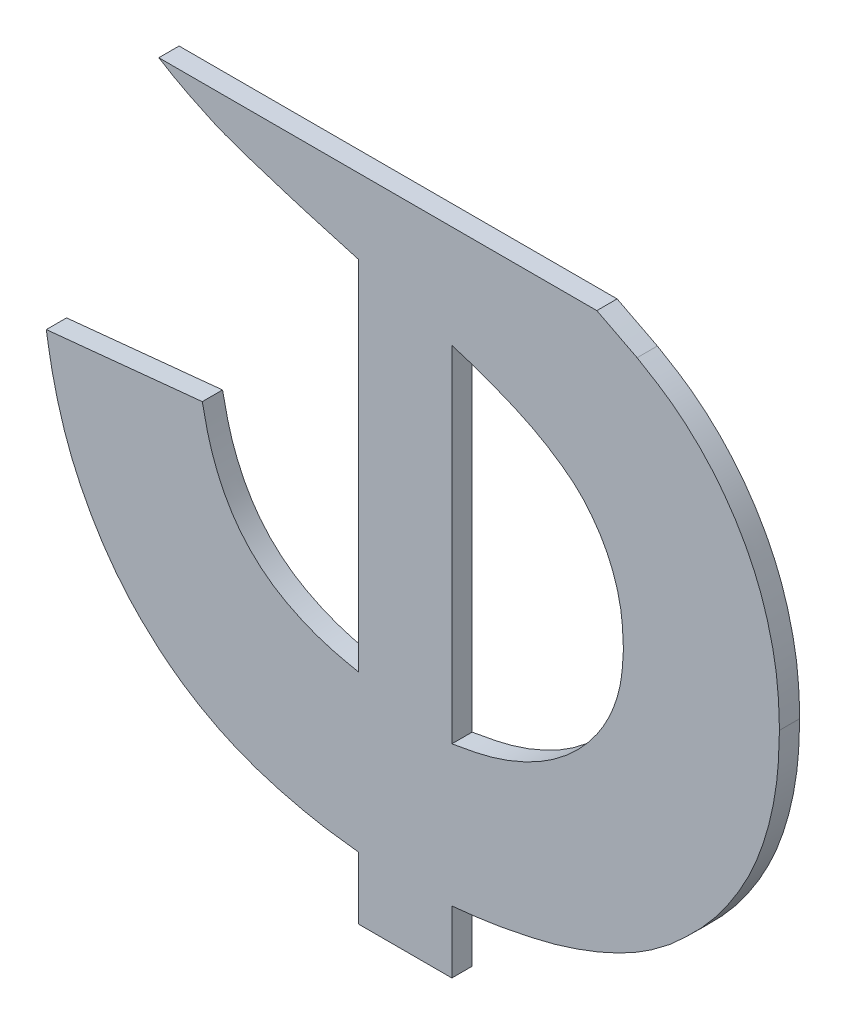
ISO-10303-21;
HEADER;
FILE_DESCRIPTION(('STEP AP214'),'2;1');
FILE_NAME('part.step','',(''),(''),'','','');
FILE_SCHEMA(('AUTOMOTIVE_DESIGN { 1 0 10303 214 1 1 1 1 }'));
ENDSEC;
DATA;
#1=APPLICATION_CONTEXT('core data for automotive mechanical design processes');
#2=APPLICATION_PROTOCOL_DEFINITION('international standard','automotive_design',2000,#1);
#3=PRODUCT_CONTEXT('',#1,'mechanical');
#4=PRODUCT('Part','Part','',(#3));
#5=PRODUCT_RELATED_PRODUCT_CATEGORY('part','',(#4));
#6=PRODUCT_DEFINITION_FORMATION('','',#4);
#7=PRODUCT_DEFINITION_CONTEXT('part definition',#1,'design');
#8=PRODUCT_DEFINITION('design','',#6,#7);
#9=PRODUCT_DEFINITION_SHAPE('','',#8);
#10=(LENGTH_UNIT() NAMED_UNIT(*) SI_UNIT(.MILLI.,.METRE.));
#11=(NAMED_UNIT(*) PLANE_ANGLE_UNIT() SI_UNIT($,.RADIAN.));
#12=(NAMED_UNIT(*) SI_UNIT($,.STERADIAN.) SOLID_ANGLE_UNIT());
#13=UNCERTAINTY_MEASURE_WITH_UNIT(LENGTH_MEASURE(1.E-05),#10,'distance_accuracy_value','');
#14=(GEOMETRIC_REPRESENTATION_CONTEXT(3) GLOBAL_UNCERTAINTY_ASSIGNED_CONTEXT((#13)) GLOBAL_UNIT_ASSIGNED_CONTEXT((#10,
#11,#12)) REPRESENTATION_CONTEXT('',''));
#15=CARTESIAN_POINT('',(0.,0.,0.));
#16=DIRECTION('',(0.,0.,1.));
#17=DIRECTION('',(1.,0.,0.));
#18=AXIS2_PLACEMENT_3D('',#15,#16,#17);
#19=CARTESIAN_POINT('',(-1.15384615384718,-2.34375,0.5));
#20=CARTESIAN_POINT('',(-1.3680750588239,-2.28125130238686,0.5));
#21=CARTESIAN_POINT('',(-1.77830490084748,-2.16157169682054,0.5));
#22=CARTESIAN_POINT('',(-2.36919092051899,-1.99602169097227,0.5));
#23=CARTESIAN_POINT('',(-2.90021615308456,-1.83591470149458,0.5));
#24=CARTESIAN_POINT('',(-3.37232213159151,-1.67939490213338,0.5));
#25=CARTESIAN_POINT('',(-3.79289653737604,-1.55494012933753,0.5));
#26=CARTESIAN_POINT('',(-4.15199864203097,-1.42253845617538,0.5));
#27=CARTESIAN_POINT('',(-4.46057924748036,-1.32110586473045,0.5));
#28=CARTESIAN_POINT('',(-4.64184961038632,-1.24309588923728,0.5));
#29=CARTESIAN_POINT('',(-4.72355769230872,-1.20793269230769,0.5));
#30=B_SPLINE_CURVE_WITH_KNOTS('',3,(#19,#20,#21,#22,#23,#24,#25,#26,#27,#28,#29),.UNSPECIFIED.,
.F.,.F.,(4,1,1,1,1,1,1,1,4),(0.,0.178626653423961,0.34205460660538,0.491185776489095,
0.622523434261208,0.740179113833693,0.842109764441101,0.928830570563335,1.),.UNSPECIFIED.);
#31=DIRECTION('',(0.,0.,1.));
#32=VECTOR('',#31,1.);
#33=SURFACE_OF_LINEAR_EXTRUSION('',#30,#32);
#34=CARTESIAN_POINT('',(-1.15384615384718,-2.34375,1.));
#35=CARTESIAN_POINT('',(-1.3680750588239,-2.28125130238686,1.));
#36=CARTESIAN_POINT('',(-1.77830490084748,-2.16157169682054,1.));
#37=CARTESIAN_POINT('',(-2.36919092051899,-1.99602169097227,1.));
#38=CARTESIAN_POINT('',(-2.90021615308456,-1.83591470149458,1.));
#39=CARTESIAN_POINT('',(-3.37232213159151,-1.67939490213338,1.));
#40=CARTESIAN_POINT('',(-3.79289653737604,-1.55494012933753,1.));
#41=CARTESIAN_POINT('',(-4.15199864203097,-1.42253845617538,1.));
#42=CARTESIAN_POINT('',(-4.46057924748036,-1.32110586473045,1.));
#43=CARTESIAN_POINT('',(-4.64184961038632,-1.24309588923728,1.));
#44=CARTESIAN_POINT('',(-4.72355769230872,-1.20793269230769,1.));
#45=B_SPLINE_CURVE_WITH_KNOTS('',3,(#34,#35,#36,#37,#38,#39,#40,#41,#42,#43,#44),.UNSPECIFIED.,
.F.,.F.,(4,1,1,1,1,1,1,1,4),(0.,0.178626653423961,0.34205460660538,0.491185776489095,
0.622523434261208,0.740179113833693,0.842109764441101,0.928830570563335,1.),.UNSPECIFIED.);
#46=CARTESIAN_POINT('',(-1.15384615384718,-2.34375,1.));
#47=VERTEX_POINT('',#46);
#48=CARTESIAN_POINT('',(-4.72355769230872,-1.20793269230769,1.));
#49=VERTEX_POINT('',#48);
#50=EDGE_CURVE('E249',#47,#49,#45,.T.);
#51=ORIENTED_EDGE('',*,*,#50,.T.);
#52=DIRECTION('',(0.,0.,1.));
#53=VECTOR('',#52,1.);
#54=CARTESIAN_POINT('',(-4.72355769230872,-1.20793269230769,0.5));
#55=LINE('',#54,#53);
#56=CARTESIAN_POINT('',(-4.72355769230872,-1.20793269230769,0.5));
#57=VERTEX_POINT('',#56);
#58=EDGE_CURVE('E259',#57,#49,#55,.T.);
#59=ORIENTED_EDGE('',*,*,#58,.F.);
#60=CARTESIAN_POINT('',(-1.15384615384718,-2.34375,0.5));
#61=VERTEX_POINT('',#60);
#62=EDGE_CURVE('E394',#61,#57,#30,.T.);
#63=ORIENTED_EDGE('',*,*,#62,.F.);
#64=DIRECTION('',(0.,0.,1.));
#65=VECTOR('',#64,1.);
#66=CARTESIAN_POINT('',(-1.15384615384718,-2.34375,0.5));
#67=LINE('',#66,#65);
#68=EDGE_CURVE('E266',#61,#47,#67,.T.);
#69=ORIENTED_EDGE('',*,*,#68,.T.);
#70=EDGE_LOOP('',(#51,#59,#63,#69));
#71=FACE_BOUND('',#70,.T.);
#72=ADVANCED_FACE('F39',(#71),#33,.F.);
#73=CARTESIAN_POINT('',(-1.15384615384718,-11.1538461538461,0.5));
#74=DIRECTION('',(1.,0.,0.));
#75=DIRECTION('',(0.,0.,-1.));
#76=AXIS2_PLACEMENT_3D('',#73,#74,#75);
#77=PLANE('',#76);
#78=DIRECTION('',(0.,1.,0.));
#79=VECTOR('',#78,1.);
#80=CARTESIAN_POINT('',(-1.15384615384718,-11.1538461538461,1.));
#81=LINE('',#80,#79);
#82=CARTESIAN_POINT('',(-1.15384615384718,-11.1538461538461,1.));
#83=VERTEX_POINT('',#82);
#84=EDGE_CURVE('E241',#83,#47,#81,.T.);
#85=ORIENTED_EDGE('',*,*,#84,.T.);
#86=ORIENTED_EDGE('',*,*,#68,.F.);
#87=DIRECTION('',(0.,1.,0.));
#88=VECTOR('',#87,1.);
#89=CARTESIAN_POINT('',(-1.15384615384718,-11.1538461538461,0.5));
#90=LINE('',#89,#88);
#91=CARTESIAN_POINT('',(-1.15384615384718,-11.1538461538461,0.5));
#92=VERTEX_POINT('',#91);
#93=EDGE_CURVE('E397',#92,#61,#90,.T.);
#94=ORIENTED_EDGE('',*,*,#93,.F.);
#95=DIRECTION('',(0.,0.,1.));
#96=VECTOR('',#95,1.);
#97=CARTESIAN_POINT('',(-1.15384615384718,-11.1538461538461,0.5));
#98=LINE('',#97,#96);
#99=EDGE_CURVE('E267',#92,#83,#98,.T.);
#100=ORIENTED_EDGE('',*,*,#99,.T.);
#101=EDGE_LOOP('',(#85,#86,#94,#100));
#102=FACE_BOUND('',#101,.T.);
#103=ADVANCED_FACE('F382',(#102),#77,.F.);
#104=CARTESIAN_POINT('',(-5.00000000000103,-7.3076923076923,0.5));
#105=CARTESIAN_POINT('',(-4.94332722294453,-7.5801396852526,0.5));
#106=CARTESIAN_POINT('',(-4.83506781833345,-8.10058340469696,0.5));
#107=CARTESIAN_POINT('',(-4.56215449920837,-8.81799140229497,0.5));
#108=CARTESIAN_POINT('',(-4.21247617403313,-9.43905347491146,0.5));
#109=CARTESIAN_POINT('',(-3.77122487480753,-9.95996253167109,0.5));
#110=CARTESIAN_POINT('',(-3.24320095468769,-10.3896267888076,0.5));
#111=CARTESIAN_POINT('',(-2.62306767237858,-10.7244989690629,0.5));
#112=CARTESIAN_POINT('',(-1.92219761273168,-10.992795150733,0.5));
#113=CARTESIAN_POINT('',(-1.41623318051299,-11.098848283588,0.5));
#114=CARTESIAN_POINT('',(-1.15384615384718,-11.1538461538461,0.5));
#115=B_SPLINE_CURVE_WITH_KNOTS('',3,(#104,#105,#106,#107,#108,#109,#110,#111,#112,#113,#114),
.UNSPECIFIED.,.F.,.F.,(4,1,1,1,1,1,1,1,4),(0.,0.142010195385213,0.27127555767699,
0.390489029977564,0.504509763600321,0.618010156769738,0.736217515739941,0.863205598409332,1.),.UNSPECIFIED.);
#116=DIRECTION('',(0.,0.,1.));
#117=VECTOR('',#116,1.);
#118=SURFACE_OF_LINEAR_EXTRUSION('',#115,#117);
#119=CARTESIAN_POINT('',(-5.00000000000103,-7.3076923076923,1.));
#120=CARTESIAN_POINT('',(-4.94332722294453,-7.5801396852526,1.));
#121=CARTESIAN_POINT('',(-4.83506781833345,-8.10058340469696,1.));
#122=CARTESIAN_POINT('',(-4.56215449920837,-8.81799140229497,1.));
#123=CARTESIAN_POINT('',(-4.21247617403313,-9.43905347491146,1.));
#124=CARTESIAN_POINT('',(-3.77122487480753,-9.95996253167109,1.));
#125=CARTESIAN_POINT('',(-3.24320095468769,-10.3896267888076,1.));
#126=CARTESIAN_POINT('',(-2.62306767237858,-10.7244989690629,1.));
#127=CARTESIAN_POINT('',(-1.92219761273168,-10.992795150733,1.));
#128=CARTESIAN_POINT('',(-1.41623318051299,-11.098848283588,1.));
#129=CARTESIAN_POINT('',(-1.15384615384718,-11.1538461538461,1.));
#130=B_SPLINE_CURVE_WITH_KNOTS('',3,(#119,#120,#121,#122,#123,#124,#125,#126,#127,#128,#129),
.UNSPECIFIED.,.F.,.F.,(4,1,1,1,1,1,1,1,4),(0.,0.142010195385213,0.27127555767699,
0.390489029977564,0.504509763600321,0.618010156769738,0.736217515739941,0.863205598409332,1.),.UNSPECIFIED.);
#131=CARTESIAN_POINT('',(-5.00000000000103,-7.3076923076923,1.));
#132=VERTEX_POINT('',#131);
#133=EDGE_CURVE('E238',#132,#83,#130,.T.);
#134=ORIENTED_EDGE('',*,*,#133,.T.);
#135=ORIENTED_EDGE('',*,*,#99,.F.);
#136=CARTESIAN_POINT('',(-5.00000000000103,-7.3076923076923,0.5));
#137=VERTEX_POINT('',#136);
#138=EDGE_CURVE('E404',#137,#92,#115,.T.);
#139=ORIENTED_EDGE('',*,*,#138,.F.);
#140=DIRECTION('',(0.,0.,1.));
#141=VECTOR('',#140,1.);
#142=CARTESIAN_POINT('',(-5.00000000000103,-7.3076923076923,0.5));
#143=LINE('',#142,#141);
#144=EDGE_CURVE('E275',#137,#132,#143,.T.);
#145=ORIENTED_EDGE('',*,*,#144,.T.);
#146=EDGE_LOOP('',(#134,#135,#139,#145));
#147=FACE_BOUND('',#146,.T.);
#148=ADVANCED_FACE('F390',(#147),#118,.F.);
#149=CARTESIAN_POINT('',(-8.84615384615488,-7.69230769230769,0.5));
#150=DIRECTION('',(0.0995037190209993,-0.995037190209989,0.));
#151=DIRECTION('',(0.995037190209989,0.0995037190209994,0.));
#152=AXIS2_PLACEMENT_3D('',#149,#150,#151);
#153=PLANE('',#152);
#154=DIRECTION('',(0.995037190209989,0.0995037190209993,0.));
#155=VECTOR('',#154,1.);
#156=CARTESIAN_POINT('',(-8.84615384615488,-7.69230769230769,1.));
#157=LINE('',#156,#155);
#158=CARTESIAN_POINT('',(-8.84615384615488,-7.69230769230769,1.));
#159=VERTEX_POINT('',#158);
#160=EDGE_CURVE('E234',#159,#132,#157,.T.);
#161=ORIENTED_EDGE('',*,*,#160,.T.);
#162=ORIENTED_EDGE('',*,*,#144,.F.);
#163=DIRECTION('',(0.995037190209989,0.0995037190209993,0.));
#164=VECTOR('',#163,1.);
#165=CARTESIAN_POINT('',(-8.84615384615488,-7.69230769230769,0.5));
#166=LINE('',#165,#164);
#167=CARTESIAN_POINT('',(-8.84615384615488,-7.69230769230769,0.5));
#168=VERTEX_POINT('',#167);
#169=EDGE_CURVE('E407',#168,#137,#166,.T.);
#170=ORIENTED_EDGE('',*,*,#169,.F.);
#171=DIRECTION('',(0.,0.,1.));
#172=VECTOR('',#171,1.);
#173=CARTESIAN_POINT('',(-8.84615384615488,-7.69230769230769,0.5));
#174=LINE('',#173,#172);
#175=EDGE_CURVE('E274',#168,#159,#174,.T.);
#176=ORIENTED_EDGE('',*,*,#175,.T.);
#177=EDGE_LOOP('',(#161,#162,#170,#176));
#178=FACE_BOUND('',#177,.T.);
#179=ADVANCED_FACE('F413',(#178),#153,.F.);
#180=CARTESIAN_POINT('',(-6.05168269230873,-13.1370192307692,0.5));
#181=CARTESIAN_POINT('',(-6.23978869501426,-12.9685949072538,0.5));
#182=CARTESIAN_POINT('',(-6.61421314638933,-12.6333467810726,0.5));
#183=CARTESIAN_POINT('',(-7.10726146899498,-12.0625471057018,0.5));
#184=CARTESIAN_POINT('',(-7.54248455188054,-11.4456407350718,0.5));
#185=CARTESIAN_POINT('',(-7.91967104027443,-10.7822657351322,0.5));
#186=CARTESIAN_POINT('',(-8.24818464159606,-10.0789953071618,0.5));
#187=CARTESIAN_POINT('',(-8.50478328462266,-9.3242229822109,0.5));
#188=CARTESIAN_POINT('',(-8.71045058078428,-8.5264827821774,0.5));
#189=CARTESIAN_POINT('',(-8.80038979866592,-7.97362169254675,0.5));
#190=CARTESIAN_POINT('',(-8.84615384615488,-7.69230769230769,0.5));
#191=B_SPLINE_CURVE_WITH_KNOTS('',3,(#180,#181,#182,#183,#184,#185,#186,#187,#188,#189,#190),
.UNSPECIFIED.,.F.,.F.,(4,1,1,1,1,1,1,1,4),(0.,0.120873366683016,0.240598084884059,
0.360430476136659,0.482097659066216,0.605777371598046,0.731744909943802,0.863502941546108,1.),.UNSPECIFIED.);
#192=DIRECTION('',(0.,0.,1.));
#193=VECTOR('',#192,1.);
#194=SURFACE_OF_LINEAR_EXTRUSION('',#191,#193);
#195=CARTESIAN_POINT('',(-6.05168269230873,-13.1370192307692,1.));
#196=CARTESIAN_POINT('',(-6.23978869501426,-12.9685949072538,1.));
#197=CARTESIAN_POINT('',(-6.61421314638933,-12.6333467810726,1.));
#198=CARTESIAN_POINT('',(-7.10726146899498,-12.0625471057018,1.));
#199=CARTESIAN_POINT('',(-7.54248455188054,-11.4456407350718,1.));
#200=CARTESIAN_POINT('',(-7.91967104027443,-10.7822657351322,1.));
#201=CARTESIAN_POINT('',(-8.24818464159606,-10.0789953071618,1.));
#202=CARTESIAN_POINT('',(-8.50478328462266,-9.3242229822109,1.));
#203=CARTESIAN_POINT('',(-8.71045058078428,-8.5264827821774,1.));
#204=CARTESIAN_POINT('',(-8.80038979866592,-7.97362169254675,1.));
#205=CARTESIAN_POINT('',(-8.84615384615488,-7.69230769230769,1.));
#206=B_SPLINE_CURVE_WITH_KNOTS('',3,(#195,#196,#197,#198,#199,#200,#201,#202,#203,#204,#205),
.UNSPECIFIED.,.F.,.F.,(4,1,1,1,1,1,1,1,4),(0.,0.120873366683016,0.240598084884059,
0.360430476136659,0.482097659066216,0.605777371598046,0.731744909943802,0.863502941546108,1.),.UNSPECIFIED.);
#207=CARTESIAN_POINT('',(-6.05168269230873,-13.1370192307692,1.));
#208=VERTEX_POINT('',#207);
#209=EDGE_CURVE('E228',#208,#159,#206,.T.);
#210=ORIENTED_EDGE('',*,*,#209,.T.);
#211=ORIENTED_EDGE('',*,*,#175,.F.);
#212=CARTESIAN_POINT('',(-6.05168269230873,-13.1370192307692,0.5));
#213=VERTEX_POINT('',#212);
#214=EDGE_CURVE('E351',#213,#168,#191,.T.);
#215=ORIENTED_EDGE('',*,*,#214,.F.);
#216=DIRECTION('',(0.,0.,1.));
#217=VECTOR('',#216,1.);
#218=CARTESIAN_POINT('',(-6.05168269230873,-13.1370192307692,0.5));
#219=LINE('',#218,#217);
#220=EDGE_CURVE('E277',#213,#208,#219,.T.);
#221=ORIENTED_EDGE('',*,*,#220,.T.);
#222=EDGE_LOOP('',(#210,#211,#215,#221));
#223=FACE_BOUND('',#222,.T.);
#224=ADVANCED_FACE('F370',(#223),#194,.F.);
#225=CARTESIAN_POINT('',(-1.15384615384718,-15.,0.5));
#226=CARTESIAN_POINT('',(-1.40475128009306,-14.9713820475116,0.5));
#227=CARTESIAN_POINT('',(-1.89696984567337,-14.9152401594024,0.5));
#228=CARTESIAN_POINT('',(-2.61098357490713,-14.7746348274559,0.5));
#229=CARTESIAN_POINT('',(-3.28568369209212,-14.6014344191461,0.5));
#230=CARTESIAN_POINT('',(-3.91998666499844,-14.3927561634975,0.5));
#231=CARTESIAN_POINT('',(-4.51284626296393,-14.1387679185141,0.5));
#232=CARTESIAN_POINT('',(-5.0650126494897,-13.8443155229025,0.5));
#233=CARTESIAN_POINT('',(-5.58086753653972,-13.5138123491459,0.5));
#234=CARTESIAN_POINT('',(-5.89549152246653,-13.2620189407968,0.5));
#235=CARTESIAN_POINT('',(-6.05168269230873,-13.1370192307692,0.5));
#236=B_SPLINE_CURVE_WITH_KNOTS('',3,(#225,#226,#227,#228,#229,#230,#231,#232,#233,#234,#235),
.UNSPECIFIED.,.F.,.F.,(4,1,1,1,1,1,1,1,4),(0.,0.14231430605743,0.279188172187838,
0.409841003140662,0.534831697569288,0.655238679043786,0.77295169903788,0.887284691173523,1.),.UNSPECIFIED.);
#237=DIRECTION('',(0.,0.,1.));
#238=VECTOR('',#237,1.);
#239=SURFACE_OF_LINEAR_EXTRUSION('',#236,#238);
#240=CARTESIAN_POINT('',(-1.15384615384718,-15.,1.));
#241=CARTESIAN_POINT('',(-1.40475128009306,-14.9713820475116,1.));
#242=CARTESIAN_POINT('',(-1.89696984567337,-14.9152401594024,1.));
#243=CARTESIAN_POINT('',(-2.61098357490713,-14.7746348274559,1.));
#244=CARTESIAN_POINT('',(-3.28568369209212,-14.6014344191461,1.));
#245=CARTESIAN_POINT('',(-3.91998666499844,-14.3927561634975,1.));
#246=CARTESIAN_POINT('',(-4.51284626296393,-14.1387679185141,1.));
#247=CARTESIAN_POINT('',(-5.0650126494897,-13.8443155229025,1.));
#248=CARTESIAN_POINT('',(-5.58086753653972,-13.5138123491459,1.));
#249=CARTESIAN_POINT('',(-5.89549152246653,-13.2620189407968,1.));
#250=CARTESIAN_POINT('',(-6.05168269230873,-13.1370192307692,1.));
#251=B_SPLINE_CURVE_WITH_KNOTS('',3,(#240,#241,#242,#243,#244,#245,#246,#247,#248,#249,#250),
.UNSPECIFIED.,.F.,.F.,(4,1,1,1,1,1,1,1,4),(0.,0.14231430605743,0.279188172187838,
0.409841003140662,0.534831697569288,0.655238679043786,0.77295169903788,0.887284691173523,1.),.UNSPECIFIED.);
#252=CARTESIAN_POINT('',(-1.15384615384718,-15.,1.));
#253=VERTEX_POINT('',#252);
#254=EDGE_CURVE('E222',#253,#208,#251,.T.);
#255=ORIENTED_EDGE('',*,*,#254,.T.);
#256=ORIENTED_EDGE('',*,*,#220,.F.);
#257=CARTESIAN_POINT('',(-1.15384615384718,-15.,0.5));
#258=VERTEX_POINT('',#257);
#259=EDGE_CURVE('E346',#258,#213,#236,.T.);
#260=ORIENTED_EDGE('',*,*,#259,.F.);
#261=DIRECTION('',(0.,0.,1.));
#262=VECTOR('',#261,1.);
#263=CARTESIAN_POINT('',(-1.15384615384718,-15.,0.5));
#264=LINE('',#263,#262);
#265=EDGE_CURVE('E282',#258,#253,#264,.T.);
#266=ORIENTED_EDGE('',*,*,#265,.T.);
#267=EDGE_LOOP('',(#255,#256,#260,#266));
#268=FACE_BOUND('',#267,.T.);
#269=ADVANCED_FACE('F365',(#268),#239,.F.);
#270=CARTESIAN_POINT('',(-1.15384615384718,-16.5384615384615,0.5));
#271=DIRECTION('',(1.,0.,0.));
#272=DIRECTION('',(0.,0.,-1.));
#273=AXIS2_PLACEMENT_3D('',#270,#271,#272);
#274=PLANE('',#273);
#275=DIRECTION('',(0.,1.,0.));
#276=VECTOR('',#275,1.);
#277=CARTESIAN_POINT('',(-1.15384615384718,-16.5384615384615,1.));
#278=LINE('',#277,#276);
#279=CARTESIAN_POINT('',(-1.15384615384718,-16.5384615384615,1.));
#280=VERTEX_POINT('',#279);
#281=EDGE_CURVE('E225',#280,#253,#278,.T.);
#282=ORIENTED_EDGE('',*,*,#281,.T.);
#283=ORIENTED_EDGE('',*,*,#265,.F.);
#284=DIRECTION('',(0.,1.,0.));
#285=VECTOR('',#284,1.);
#286=CARTESIAN_POINT('',(-1.15384615384718,-16.5384615384615,0.5));
#287=LINE('',#286,#285);
#288=CARTESIAN_POINT('',(-1.15384615384718,-16.5384615384615,0.5));
#289=VERTEX_POINT('',#288);
#290=EDGE_CURVE('E348',#289,#258,#287,.T.);
#291=ORIENTED_EDGE('',*,*,#290,.F.);
#292=DIRECTION('',(0.,0.,1.));
#293=VECTOR('',#292,1.);
#294=CARTESIAN_POINT('',(-1.15384615384718,-16.5384615384615,0.5));
#295=LINE('',#294,#293);
#296=EDGE_CURVE('E281',#289,#280,#295,.T.);
#297=ORIENTED_EDGE('',*,*,#296,.T.);
#298=EDGE_LOOP('',(#282,#283,#291,#297));
#299=FACE_BOUND('',#298,.T.);
#300=ADVANCED_FACE('F366',(#299),#274,.F.);
#301=CARTESIAN_POINT('',(1.15384615384512,-16.5384615384615,0.5));
#302=DIRECTION('',(0.,1.,0.));
#303=DIRECTION('',(0.,0.,1.));
#304=AXIS2_PLACEMENT_3D('',#301,#302,#303);
#305=PLANE('',#304);
#306=DIRECTION('',(-1.,0.,0.));
#307=VECTOR('',#306,1.);
#308=CARTESIAN_POINT('',(1.15384615384512,-16.5384615384615,1.));
#309=LINE('',#308,#307);
#310=CARTESIAN_POINT('',(1.15384615384512,-16.5384615384615,1.));
#311=VERTEX_POINT('',#310);
#312=EDGE_CURVE('E217',#311,#280,#309,.T.);
#313=ORIENTED_EDGE('',*,*,#312,.T.);
#314=ORIENTED_EDGE('',*,*,#296,.F.);
#315=DIRECTION('',(-1.,0.,0.));
#316=VECTOR('',#315,1.);
#317=CARTESIAN_POINT('',(1.15384615384512,-16.5384615384615,0.5));
#318=LINE('',#317,#316);
#319=CARTESIAN_POINT('',(1.15384615384512,-16.5384615384615,0.5));
#320=VERTEX_POINT('',#319);
#321=EDGE_CURVE('E341',#320,#289,#318,.T.);
#322=ORIENTED_EDGE('',*,*,#321,.F.);
#323=DIRECTION('',(0.,0.,1.));
#324=VECTOR('',#323,1.);
#325=CARTESIAN_POINT('',(1.15384615384512,-16.5384615384615,0.5));
#326=LINE('',#325,#324);
#327=EDGE_CURVE('E289',#320,#311,#326,.T.);
#328=ORIENTED_EDGE('',*,*,#327,.T.);
#329=EDGE_LOOP('',(#313,#314,#322,#328));
#330=FACE_BOUND('',#329,.T.);
#331=ADVANCED_FACE('F372',(#330),#305,.F.);
#332=CARTESIAN_POINT('',(1.15384615384512,-15.,0.5));
#333=DIRECTION('',(-1.,0.,0.));
#334=DIRECTION('',(0.,0.,1.));
#335=AXIS2_PLACEMENT_3D('',#332,#333,#334);
#336=PLANE('',#335);
#337=DIRECTION('',(0.,-1.,0.));
#338=VECTOR('',#337,1.);
#339=CARTESIAN_POINT('',(1.15384615384512,-15.,1.));
#340=LINE('',#339,#338);
#341=CARTESIAN_POINT('',(1.15384615384512,-15.,1.));
#342=VERTEX_POINT('',#341);
#343=EDGE_CURVE('E214',#342,#311,#340,.T.);
#344=ORIENTED_EDGE('',*,*,#343,.T.);
#345=ORIENTED_EDGE('',*,*,#327,.F.);
#346=DIRECTION('',(0.,-1.,0.));
#347=VECTOR('',#346,1.);
#348=CARTESIAN_POINT('',(1.15384615384512,-15.,0.5));
#349=LINE('',#348,#347);
#350=CARTESIAN_POINT('',(1.15384615384512,-15.,0.5));
#351=VERTEX_POINT('',#350);
#352=EDGE_CURVE('E339',#351,#320,#349,.T.);
#353=ORIENTED_EDGE('',*,*,#352,.F.);
#354=DIRECTION('',(0.,0.,1.));
#355=VECTOR('',#354,1.);
#356=CARTESIAN_POINT('',(1.15384615384512,-15.,0.5));
#357=LINE('',#356,#355);
#358=EDGE_CURVE('E288',#351,#342,#357,.T.);
#359=ORIENTED_EDGE('',*,*,#358,.T.);
#360=EDGE_LOOP('',(#344,#345,#353,#359));
#361=FACE_BOUND('',#360,.T.);
#362=ADVANCED_FACE('F334',(#361),#336,.F.);
#363=CARTESIAN_POINT('',(6.52644230769128,-13.1370192307692,0.5));
#364=CARTESIAN_POINT('',(6.3685808938014,-13.2606185267119,0.5));
#365=CARTESIAN_POINT('',(6.04638430744038,-13.5128858176733,0.5));
#366=CARTESIAN_POINT('',(5.50599013705718,-13.8346872744257,0.5));
#367=CARTESIAN_POINT('',(4.91502133565969,-14.1239899231774,0.5));
#368=CARTESIAN_POINT('',(4.26916780444103,-14.3747667206419,0.5));
#369=CARTESIAN_POINT('',(3.56932035198438,-14.5939811553312,0.5));
#370=CARTESIAN_POINT('',(2.81192361256806,-14.7604166388626,0.5));
#371=CARTESIAN_POINT('',(2.00328336051357,-14.9117659324476,0.5));
#372=CARTESIAN_POINT('',(1.44288408469758,-14.9699766008413,0.5));
#373=CARTESIAN_POINT('',(1.15384615384512,-15.,0.5));
#374=B_SPLINE_CURVE_WITH_KNOTS('',3,(#363,#364,#365,#366,#367,#368,#369,#370,#371,#372,#373),
.UNSPECIFIED.,.F.,.F.,(4,1,1,1,1,1,1,1,4),(0.,0.104160498625151,0.212592528241868,
0.326256404655832,0.445986621133482,0.57249768332098,0.707171206395927,0.848967276993531,1.),.UNSPECIFIED.);
#375=DIRECTION('',(0.,0.,1.));
#376=VECTOR('',#375,1.);
#377=SURFACE_OF_LINEAR_EXTRUSION('',#374,#376);
#378=CARTESIAN_POINT('',(6.52644230769128,-13.1370192307692,1.));
#379=CARTESIAN_POINT('',(6.3685808938014,-13.2606185267119,1.));
#380=CARTESIAN_POINT('',(6.04638430744038,-13.5128858176733,1.));
#381=CARTESIAN_POINT('',(5.50599013705718,-13.8346872744257,1.));
#382=CARTESIAN_POINT('',(4.91502133565969,-14.1239899231774,1.));
#383=CARTESIAN_POINT('',(4.26916780444103,-14.3747667206419,1.));
#384=CARTESIAN_POINT('',(3.56932035198438,-14.5939811553312,1.));
#385=CARTESIAN_POINT('',(2.81192361256806,-14.7604166388626,1.));
#386=CARTESIAN_POINT('',(2.00328336051357,-14.9117659324476,1.));
#387=CARTESIAN_POINT('',(1.44288408469758,-14.9699766008413,1.));
#388=CARTESIAN_POINT('',(1.15384615384512,-15.,1.));
#389=B_SPLINE_CURVE_WITH_KNOTS('',3,(#378,#379,#380,#381,#382,#383,#384,#385,#386,#387,#388),
.UNSPECIFIED.,.F.,.F.,(4,1,1,1,1,1,1,1,4),(0.,0.104160498625151,0.212592528241868,
0.326256404655832,0.445986621133482,0.57249768332098,0.707171206395927,0.848967276993531,1.),.UNSPECIFIED.);
#390=CARTESIAN_POINT('',(6.52644230769128,-13.1370192307692,1.));
#391=VERTEX_POINT('',#390);
#392=EDGE_CURVE('E210',#391,#342,#389,.T.);
#393=ORIENTED_EDGE('',*,*,#392,.T.);
#394=ORIENTED_EDGE('',*,*,#358,.F.);
#395=CARTESIAN_POINT('',(6.52644230769128,-13.1370192307692,0.5));
#396=VERTEX_POINT('',#395);
#397=EDGE_CURVE('E310',#396,#351,#374,.T.);
#398=ORIENTED_EDGE('',*,*,#397,.F.);
#399=DIRECTION('',(0.,0.,1.));
#400=VECTOR('',#399,1.);
#401=CARTESIAN_POINT('',(6.52644230769128,-13.1370192307692,0.5));
#402=LINE('',#401,#400);
#403=EDGE_CURVE('E291',#396,#391,#402,.T.);
#404=ORIENTED_EDGE('',*,*,#403,.T.);
#405=EDGE_LOOP('',(#393,#394,#398,#404));
#406=FACE_BOUND('',#405,.T.);
#407=ADVANCED_FACE('F326',(#406),#377,.F.);
#408=CARTESIAN_POINT('',(9.2307692307682,-7.21153846153846,0.5));
#409=CARTESIAN_POINT('',(9.22311626134607,-7.51048456967435,0.5));
#410=CARTESIAN_POINT('',(9.20814940580367,-8.09513125629227,0.5));
#411=CARTESIAN_POINT('',(9.07829513114574,-8.94941365296541,0.5));
#412=CARTESIAN_POINT('',(8.8683166204323,-9.75963982067989,0.5));
#413=CARTESIAN_POINT('',(8.57368810582475,-10.5299240720903,0.5));
#414=CARTESIAN_POINT('',(8.18559587815645,-11.2514929995058,0.5));
#415=CARTESIAN_POINT('',(7.71894440957279,-11.9329177620352,0.5));
#416=CARTESIAN_POINT('',(7.1636903456754,-12.5660581477758,0.5));
#417=CARTESIAN_POINT('',(6.74086125547907,-12.9449042812583,0.5));
#418=CARTESIAN_POINT('',(6.52644230769128,-13.1370192307692,0.5));
#419=B_SPLINE_CURVE_WITH_KNOTS('',3,(#408,#409,#410,#411,#412,#413,#414,#415,#416,#417,#418),
.UNSPECIFIED.,.F.,.F.,(4,1,1,1,1,1,1,1,4),(0.,0.133005923266197,0.260118697724574,
0.383611486222009,0.50499052228668,0.62625815030946,0.747450355995756,0.871930692123314,1.),.UNSPECIFIED.);
#420=DIRECTION('',(0.,0.,1.));
#421=VECTOR('',#420,1.);
#422=SURFACE_OF_LINEAR_EXTRUSION('',#419,#421);
#423=CARTESIAN_POINT('',(9.2307692307682,-7.21153846153846,1.));
#424=CARTESIAN_POINT('',(9.22311626134607,-7.51048456967435,1.));
#425=CARTESIAN_POINT('',(9.20814940580367,-8.09513125629227,1.));
#426=CARTESIAN_POINT('',(9.07829513114574,-8.94941365296541,1.));
#427=CARTESIAN_POINT('',(8.8683166204323,-9.75963982067989,1.));
#428=CARTESIAN_POINT('',(8.57368810582475,-10.5299240720903,1.));
#429=CARTESIAN_POINT('',(8.18559587815645,-11.2514929995058,1.));
#430=CARTESIAN_POINT('',(7.71894440957279,-11.9329177620352,1.));
#431=CARTESIAN_POINT('',(7.1636903456754,-12.5660581477758,1.));
#432=CARTESIAN_POINT('',(6.74086125547907,-12.9449042812583,1.));
#433=CARTESIAN_POINT('',(6.52644230769128,-13.1370192307692,1.));
#434=B_SPLINE_CURVE_WITH_KNOTS('',3,(#423,#424,#425,#426,#427,#428,#429,#430,#431,#432,#433),
.UNSPECIFIED.,.F.,.F.,(4,1,1,1,1,1,1,1,4),(0.,0.133005923266197,0.260118697724574,
0.383611486222009,0.50499052228668,0.62625815030946,0.747450355995756,0.871930692123314,1.),.UNSPECIFIED.);
#435=CARTESIAN_POINT('',(9.2307692307682,-7.21153846153846,1.));
#436=VERTEX_POINT('',#435);
#437=EDGE_CURVE('E182',#436,#391,#434,.T.);
#438=ORIENTED_EDGE('',*,*,#437,.T.);
#439=ORIENTED_EDGE('',*,*,#403,.F.);
#440=CARTESIAN_POINT('',(9.2307692307682,-7.21153846153846,0.5));
#441=VERTEX_POINT('',#440);
#442=EDGE_CURVE('E304',#441,#396,#419,.T.);
#443=ORIENTED_EDGE('',*,*,#442,.F.);
#444=DIRECTION('',(0.,0.,1.));
#445=VECTOR('',#444,1.);
#446=CARTESIAN_POINT('',(9.2307692307682,-7.21153846153846,0.5));
#447=LINE('',#446,#445);
#448=EDGE_CURVE('E293',#441,#436,#447,.T.);
#449=ORIENTED_EDGE('',*,*,#448,.T.);
#450=EDGE_LOOP('',(#438,#439,#443,#449));
#451=FACE_BOUND('',#450,.T.);
#452=ADVANCED_FACE('F327',(#451),#422,.F.);
#453=CARTESIAN_POINT('',(5.72115384615282,-1.00961538461538,0.5));
#454=CARTESIAN_POINT('',(5.99080971485287,-1.16822968693966,0.5));
#455=CARTESIAN_POINT('',(6.52308102170324,-1.48131703931326,0.5));
#456=CARTESIAN_POINT('',(7.22515393775635,-2.08118733351363,0.5));
#457=CARTESIAN_POINT('',(7.8314996792492,-2.76534819367226,0.5));
#458=CARTESIAN_POINT('',(8.33652128831874,-3.53333352612733,0.5));
#459=CARTESIAN_POINT('',(8.74279551775079,-4.36824642060223,0.5));
#460=CARTESIAN_POINT('',(9.0220306935514,-5.27040544618946,0.5));
#461=CARTESIAN_POINT('',(9.20445939133295,-6.22258931637336,0.5));
#462=CARTESIAN_POINT('',(9.22189961275289,-6.87814223630634,0.5));
#463=CARTESIAN_POINT('',(9.2307692307682,-7.21153846153846,0.5));
#464=B_SPLINE_CURVE_WITH_KNOTS('',3,(#453,#454,#455,#456,#457,#458,#459,#460,#461,#462,#463),
.UNSPECIFIED.,.F.,.F.,(4,1,1,1,1,1,1,1,4),(0.,0.124999678579778,0.24673574728515,
0.36770126814457,0.489766834742444,0.613466726310562,0.737951216288287,0.866729179811929,1.),.UNSPECIFIED.);
#465=DIRECTION('',(0.,0.,1.));
#466=VECTOR('',#465,1.);
#467=SURFACE_OF_LINEAR_EXTRUSION('',#464,#466);
#468=CARTESIAN_POINT('',(5.72115384615282,-1.00961538461538,1.));
#469=CARTESIAN_POINT('',(5.99080971485287,-1.16822968693966,1.));
#470=CARTESIAN_POINT('',(6.52308102170324,-1.48131703931326,1.));
#471=CARTESIAN_POINT('',(7.22515393775635,-2.08118733351363,1.));
#472=CARTESIAN_POINT('',(7.8314996792492,-2.76534819367226,1.));
#473=CARTESIAN_POINT('',(8.33652128831874,-3.53333352612733,1.));
#474=CARTESIAN_POINT('',(8.74279551775079,-4.36824642060223,1.));
#475=CARTESIAN_POINT('',(9.0220306935514,-5.27040544618946,1.));
#476=CARTESIAN_POINT('',(9.20445939133295,-6.22258931637336,1.));
#477=CARTESIAN_POINT('',(9.22189961275289,-6.87814223630634,1.));
#478=CARTESIAN_POINT('',(9.2307692307682,-7.21153846153846,1.));
#479=B_SPLINE_CURVE_WITH_KNOTS('',3,(#468,#469,#470,#471,#472,#473,#474,#475,#476,#477,#478),
.UNSPECIFIED.,.F.,.F.,(4,1,1,1,1,1,1,1,4),(0.,0.124999678579778,0.24673574728515,
0.36770126814457,0.489766834742444,0.613466726310562,0.737951216288287,0.866729179811929,1.),.UNSPECIFIED.);
#480=CARTESIAN_POINT('',(5.72115384615281,-1.00961538461538,1.));
#481=VERTEX_POINT('',#480);
#482=EDGE_CURVE('E181',#481,#436,#479,.T.);
#483=ORIENTED_EDGE('',*,*,#482,.T.);
#484=ORIENTED_EDGE('',*,*,#448,.F.);
#485=CARTESIAN_POINT('',(5.72115384615281,-1.00961538461538,0.5));
#486=VERTEX_POINT('',#485);
#487=EDGE_CURVE('E301',#486,#441,#464,.T.);
#488=ORIENTED_EDGE('',*,*,#487,.F.);
#489=DIRECTION('',(0.,0.,1.));
#490=VECTOR('',#489,1.);
#491=CARTESIAN_POINT('',(5.72115384615281,-1.00961538461538,0.5));
#492=LINE('',#491,#490);
#493=EDGE_CURVE('E42',#486,#481,#492,.T.);
#494=ORIENTED_EDGE('',*,*,#493,.T.);
#495=EDGE_LOOP('',(#483,#484,#488,#494));
#496=FACE_BOUND('',#495,.T.);
#497=ADVANCED_FACE('F302',(#496),#467,.F.);
#498=CARTESIAN_POINT('',(1.15384615384512,-11.5384615384615,0.5));
#499=CARTESIAN_POINT('',(1.4666918069389,-11.4839237668936,0.5));
#500=CARTESIAN_POINT('',(2.06781344467557,-11.3791314060627,0.5));
#501=CARTESIAN_POINT('',(2.90375705770068,-11.0728212884302,0.5));
#502=CARTESIAN_POINT('',(3.63802817972395,-10.6623882628302,0.5));
#503=CARTESIAN_POINT('',(4.259286527402,-10.1428029471191,0.5));
#504=CARTESIAN_POINT('',(4.76205503896709,-9.5436439931761,0.5));
#505=CARTESIAN_POINT('',(5.12341959894646,-8.87758576572554,0.5));
#506=CARTESIAN_POINT('',(5.34421066955958,-8.15677631602199,0.5));
#507=CARTESIAN_POINT('',(5.37098753395659,-7.65779720366658,0.5));
#508=CARTESIAN_POINT('',(5.38461538461435,-7.40384615384615,0.5));
#509=B_SPLINE_CURVE_WITH_KNOTS('',3,(#498,#499,#500,#501,#502,#503,#504,#505,#506,#507,#508),
.UNSPECIFIED.,.F.,.F.,(4,1,1,1,1,1,1,1,4),(0.,0.146706498608907,0.281891245214024,
0.409742523432347,0.53412257099334,0.654586250272817,0.769475140950056,0.8826763916247,1.),.UNSPECIFIED.);
#510=DIRECTION('',(0.,0.,1.));
#511=VECTOR('',#510,1.);
#512=SURFACE_OF_LINEAR_EXTRUSION('',#509,#511);
#513=CARTESIAN_POINT('',(1.15384615384512,-11.5384615384615,1.));
#514=CARTESIAN_POINT('',(1.4666918069389,-11.4839237668936,1.));
#515=CARTESIAN_POINT('',(2.06781344467557,-11.3791314060627,1.));
#516=CARTESIAN_POINT('',(2.90375705770068,-11.0728212884302,1.));
#517=CARTESIAN_POINT('',(3.63802817972395,-10.6623882628302,1.));
#518=CARTESIAN_POINT('',(4.259286527402,-10.1428029471191,1.));
#519=CARTESIAN_POINT('',(4.76205503896709,-9.5436439931761,1.));
#520=CARTESIAN_POINT('',(5.12341959894646,-8.87758576572554,1.));
#521=CARTESIAN_POINT('',(5.34421066955958,-8.15677631602199,1.));
#522=CARTESIAN_POINT('',(5.37098753395659,-7.65779720366658,1.));
#523=CARTESIAN_POINT('',(5.38461538461435,-7.40384615384615,1.));
#524=B_SPLINE_CURVE_WITH_KNOTS('',3,(#513,#514,#515,#516,#517,#518,#519,#520,#521,#522,#523),
.UNSPECIFIED.,.F.,.F.,(4,1,1,1,1,1,1,1,4),(0.,0.146706498608907,0.281891245214024,
0.409742523432347,0.53412257099334,0.654586250272817,0.769475140950056,0.8826763916247,1.),.UNSPECIFIED.);
#525=CARTESIAN_POINT('',(1.15384615384512,-11.5384615384615,1.));
#526=VERTEX_POINT('',#525);
#527=CARTESIAN_POINT('',(5.38461538461435,-7.40384615384615,1.));
#528=VERTEX_POINT('',#527);
#529=EDGE_CURVE('E503',#526,#528,#524,.T.);
#530=ORIENTED_EDGE('',*,*,#529,.T.);
#531=DIRECTION('',(0.,0.,1.));
#532=VECTOR('',#531,1.);
#533=CARTESIAN_POINT('',(5.38461538461435,-7.40384615384615,0.5));
#534=LINE('',#533,#532);
#535=CARTESIAN_POINT('',(5.38461538461435,-7.40384615384615,0.5));
#536=VERTEX_POINT('',#535);
#537=EDGE_CURVE('E186',#536,#528,#534,.T.);
#538=ORIENTED_EDGE('',*,*,#537,.F.);
#539=CARTESIAN_POINT('',(1.15384615384512,-11.5384615384615,0.5));
#540=VERTEX_POINT('',#539);
#541=EDGE_CURVE('E463',#540,#536,#509,.T.);
#542=ORIENTED_EDGE('',*,*,#541,.F.);
#543=DIRECTION('',(0.,0.,1.));
#544=VECTOR('',#543,1.);
#545=CARTESIAN_POINT('',(1.15384615384512,-11.5384615384615,0.5));
#546=LINE('',#545,#544);
#547=EDGE_CURVE('E519',#540,#526,#546,.T.);
#548=ORIENTED_EDGE('',*,*,#547,.T.);
#549=EDGE_LOOP('',(#530,#538,#542,#548));
#550=FACE_BOUND('',#549,.T.);
#551=ADVANCED_FACE('F324',(#550),#512,.F.);
#552=CARTESIAN_POINT('',(1.15384615384512,-3.02884615384615,0.5));
#553=DIRECTION('',(-1.,0.,0.));
#554=DIRECTION('',(0.,0.,1.));
#555=AXIS2_PLACEMENT_3D('',#552,#553,#554);
#556=PLANE('',#555);
#557=DIRECTION('',(0.,-1.,0.));
#558=VECTOR('',#557,1.);
#559=CARTESIAN_POINT('',(1.15384615384512,-3.02884615384615,1.));
#560=LINE('',#559,#558);
#561=CARTESIAN_POINT('',(1.15384615384512,-3.02884615384615,1.));
#562=VERTEX_POINT('',#561);
#563=EDGE_CURVE('E176',#562,#526,#560,.T.);
#564=ORIENTED_EDGE('',*,*,#563,.T.);
#565=ORIENTED_EDGE('',*,*,#547,.F.);
#566=DIRECTION('',(0.,-1.,0.));
#567=VECTOR('',#566,1.);
#568=CARTESIAN_POINT('',(1.15384615384512,-3.02884615384615,0.5));
#569=LINE('',#568,#567);
#570=CARTESIAN_POINT('',(1.15384615384512,-3.02884615384615,0.5));
#571=VERTEX_POINT('',#570);
#572=EDGE_CURVE('E465',#571,#540,#569,.T.);
#573=ORIENTED_EDGE('',*,*,#572,.F.);
#574=DIRECTION('',(0.,0.,1.));
#575=VECTOR('',#574,1.);
#576=CARTESIAN_POINT('',(1.15384615384512,-3.02884615384615,0.5));
#577=LINE('',#576,#575);
#578=EDGE_CURVE('E185',#571,#562,#577,.T.);
#579=ORIENTED_EDGE('',*,*,#578,.T.);
#580=EDGE_LOOP('',(#564,#565,#573,#579));
#581=FACE_BOUND('',#580,.T.);
#582=ADVANCED_FACE('F481',(#581),#556,.F.);
#583=CARTESIAN_POINT('',(5.38461538461435,-7.40384615384615,0.5));
#584=CARTESIAN_POINT('',(5.37534094723635,-7.15445005604813,0.5));
#585=CARTESIAN_POINT('',(5.35730962622701,-6.66957524212785,0.5));
#586=CARTESIAN_POINT('',(5.18506219068425,-5.97421875006338,0.5));
#587=CARTESIAN_POINT('',(4.89912973890344,-5.34489526128878,0.5));
#588=CARTESIAN_POINT('',(4.56675514929172,-4.87574635101671,0.5));
#589=CARTESIAN_POINT('',(4.24103237037679,-4.52971288655904,0.5));
#590=CARTESIAN_POINT('',(3.9381859999114,-4.28734593074997,0.5));
#591=CARTESIAN_POINT('',(3.59182465670507,-4.05180671907175,0.5));
#592=CARTESIAN_POINT('',(3.19988941301864,-3.82161043272065,0.5));
#593=CARTESIAN_POINT('',(2.75597454358666,-3.60928425244549,0.5));
#594=CARTESIAN_POINT('',(2.26418425129991,-3.40388642687135,0.5));
#595=CARTESIAN_POINT('',(1.72705839310339,-3.20642741835621,0.5));
#596=CARTESIAN_POINT('',(1.34872773338199,-3.08922050553246,0.5));
#597=CARTESIAN_POINT('',(1.15384615384512,-3.02884615384615,0.5));
#598=B_SPLINE_CURVE_WITH_KNOTS('',3,(#583,#584,#585,#586,#587,#588,#589,#590,#591,#592,#593,
#594,#595,#596,#597),.UNSPECIFIED.,.F.,.F.,(4,1,1,1,1,1,1,1,1,1,1,1,4),(0.,0.112630621382554,
0.218975966612036,0.321542106330029,0.423590829532918,0.477415481378158,0.535993403246883,
0.598561517535909,0.666771369212675,0.741322176624057,0.820904777199573,0.907746414386412,1.),.UNSPECIFIED.);
#599=DIRECTION('',(0.,0.,1.));
#600=VECTOR('',#599,1.);
#601=SURFACE_OF_LINEAR_EXTRUSION('',#598,#600);
#602=CARTESIAN_POINT('',(5.38461538461435,-7.40384615384615,1.));
#603=CARTESIAN_POINT('',(5.37534094723635,-7.15445005604813,1.));
#604=CARTESIAN_POINT('',(5.35730962622701,-6.66957524212785,1.));
#605=CARTESIAN_POINT('',(5.18506219068425,-5.97421875006338,1.));
#606=CARTESIAN_POINT('',(4.89912973890344,-5.34489526128878,1.));
#607=CARTESIAN_POINT('',(4.56675514929172,-4.87574635101671,1.));
#608=CARTESIAN_POINT('',(4.24103237037679,-4.52971288655904,1.));
#609=CARTESIAN_POINT('',(3.9381859999114,-4.28734593074997,1.));
#610=CARTESIAN_POINT('',(3.59182465670507,-4.05180671907175,1.));
#611=CARTESIAN_POINT('',(3.19988941301864,-3.82161043272065,1.));
#612=CARTESIAN_POINT('',(2.75597454358666,-3.60928425244549,1.));
#613=CARTESIAN_POINT('',(2.26418425129991,-3.40388642687135,1.));
#614=CARTESIAN_POINT('',(1.72705839310339,-3.20642741835621,1.));
#615=CARTESIAN_POINT('',(1.34872773338199,-3.08922050553246,1.));
#616=CARTESIAN_POINT('',(1.15384615384512,-3.02884615384615,1.));
#617=B_SPLINE_CURVE_WITH_KNOTS('',3,(#602,#603,#604,#605,#606,#607,#608,#609,#610,#611,#612,
#613,#614,#615,#616),.UNSPECIFIED.,.F.,.F.,(4,1,1,1,1,1,1,1,1,1,1,1,4),(0.,0.112630621382554,
0.218975966612036,0.321542106330029,0.423590829532918,0.477415481378158,0.535993403246883,
0.598561517535909,0.666771369212675,0.741322176624057,0.820904777199573,0.907746414386412,1.),.UNSPECIFIED.);
#618=EDGE_CURVE('E467',#528,#562,#617,.T.);
#619=ORIENTED_EDGE('',*,*,#618,.T.);
#620=ORIENTED_EDGE('',*,*,#578,.F.);
#621=EDGE_CURVE('E61',#536,#571,#598,.T.);
#622=ORIENTED_EDGE('',*,*,#621,.F.);
#623=ORIENTED_EDGE('',*,*,#537,.T.);
#624=EDGE_LOOP('',(#619,#620,#622,#623));
#625=FACE_BOUND('',#624,.T.);
#626=ADVANCED_FACE('F484',(#625),#601,.F.);
#627=CARTESIAN_POINT('',(7.41139186249021,12.7931073927375,0.5));
#628=DIRECTION('',(0.,0.,1.));
#629=DIRECTION('',(0.,-1.,0.));
#630=AXIS2_PLACEMENT_3D('',#627,#628,#629);
#631=PLANE('',#630);
#632=ORIENTED_EDGE('',*,*,#621,.T.);
#633=ORIENTED_EDGE('',*,*,#572,.T.);
#634=ORIENTED_EDGE('',*,*,#541,.T.);
#635=EDGE_LOOP('',(#632,#633,#634));
#636=FACE_BOUND('',#635,.T.);
#637=CARTESIAN_POINT('',(-4.72355769230872,-1.20793269230769,0.5));
#638=CARTESIAN_POINT('',(-4.99055263360475,-1.08468379020654,0.5));
#639=CARTESIAN_POINT('',(-5.50975341105892,-0.845012860560216,0.5));
#640=CARTESIAN_POINT('',(-6.2262233069939,-0.412378697700301,0.5));
#641=CARTESIAN_POINT('',(-6.8746482206749,0.0476869164056308,0.5));
#642=CARTESIAN_POINT('',(-7.44668441314561,0.556318050159919,0.5));
#643=CARTESIAN_POINT('',(-7.94033959987337,1.11552185514443,0.5));
#644=CARTESIAN_POINT('',(-8.37960139666254,1.71453011685075,0.5));
#645=CARTESIAN_POINT('',(-8.75132379625618,2.36695925351342,0.5));
#646=CARTESIAN_POINT('',(-9.06283405279038,3.06337171504091,0.5));
#647=CARTESIAN_POINT('',(-9.31209001791595,3.79922497951258,0.5));
#648=CARTESIAN_POINT('',(-9.48148633531398,4.56937138693258,0.5));
#649=CARTESIAN_POINT('',(-9.59605696376056,5.36718351148169,0.5));
#650=CARTESIAN_POINT('',(-9.60888025027107,5.90904528303998,0.5));
#651=CARTESIAN_POINT('',(-9.61538461538565,6.18389423076923,0.5));
#652=B_SPLINE_CURVE_WITH_KNOTS('',3,(#637,#638,#639,#640,#641,#642,#643,#644,#645,#646,#647,
#648,#649,#650,#651),.UNSPECIFIED.,.F.,.F.,(4,1,1,1,1,1,1,1,1,1,1,1,4),(0.,0.0933920285341042,
0.181610983292623,0.265535446399889,0.345791528241057,0.424249841898664,0.502182062068234,
0.581462596910971,0.662392562061222,0.744330380200334,0.827884581179354,0.912697768630566,1.),.UNSPECIFIED.);
#653=CARTESIAN_POINT('',(-6.07145783433343,-0.5,0.49999999999978));
#654=VERTEX_POINT('',#653);
#655=EDGE_CURVE('E192',#57,#654,#652,.T.);
#656=ORIENTED_EDGE('',*,*,#655,.T.);
#657=DIRECTION('',(1.,0.,0.));
#658=VECTOR('',#657,1.);
#659=CARTESIAN_POINT('',(7.41139186249021,-0.5,0.499999999999814));
#660=LINE('',#659,#658);
#661=CARTESIAN_POINT('',(4.72830655931924,-0.50000000973936,0.5));
#662=VERTEX_POINT('',#661);
#663=EDGE_CURVE('E460',#654,#662,#660,.T.);
#664=ORIENTED_EDGE('',*,*,#663,.T.);
#665=CARTESIAN_POINT('',(1.15384615384512,0.907451923076926,0.5));
#666=CARTESIAN_POINT('',(1.53589483561012,0.787459078570652,0.5));
#667=CARTESIAN_POINT('',(2.30950065305536,0.544486999376424,0.5));
#668=CARTESIAN_POINT('',(3.45324385303347,0.0985681934332246,0.5));
#669=CARTESIAN_POINT('',(4.59457231407182,-0.421585353285465,0.5));
#670=CARTESIAN_POINT('',(5.34226271752965,-0.811849527559873,0.5));
#671=CARTESIAN_POINT('',(5.72115384615281,-1.00961538461538,0.5));
#672=B_SPLINE_CURVE_WITH_KNOTS('',3,(#665,#666,#667,#668,#669,#670,#671),.UNSPECIFIED.,.F.,.F.,
(4,1,1,1,4),(0.,0.242058272273776,0.490140907505919,0.741629575422577,1.),.UNSPECIFIED.);
#673=EDGE_CURVE('E172',#662,#486,#672,.T.);
#674=ORIENTED_EDGE('',*,*,#673,.T.);
#675=ORIENTED_EDGE('',*,*,#487,.T.);
#676=ORIENTED_EDGE('',*,*,#442,.T.);
#677=ORIENTED_EDGE('',*,*,#397,.T.);
#678=ORIENTED_EDGE('',*,*,#352,.T.);
#679=ORIENTED_EDGE('',*,*,#321,.T.);
#680=ORIENTED_EDGE('',*,*,#290,.T.);
#681=ORIENTED_EDGE('',*,*,#259,.T.);
#682=ORIENTED_EDGE('',*,*,#214,.T.);
#683=ORIENTED_EDGE('',*,*,#169,.T.);
#684=ORIENTED_EDGE('',*,*,#138,.T.);
#685=ORIENTED_EDGE('',*,*,#93,.T.);
#686=ORIENTED_EDGE('',*,*,#62,.T.);
#687=EDGE_LOOP('',(#656,#664,#674,#675,#676,#677,#678,#679,#680,#681,#682,#683,#684,#685,#686));
#688=FACE_BOUND('',#687,.T.);
#689=ADVANCED_FACE('F440',(#636,#688),#631,.F.);
#690=DIRECTION('',(0.,0.,1.));
#691=VECTOR('',#690,1.);
#692=SURFACE_OF_LINEAR_EXTRUSION('',#652,#691);
#693=CARTESIAN_POINT('',(-4.72355769230872,-1.20793269230769,1.));
#694=CARTESIAN_POINT('',(-4.99055263360475,-1.08468379020654,1.));
#695=CARTESIAN_POINT('',(-5.50975341105892,-0.845012860560216,1.));
#696=CARTESIAN_POINT('',(-6.2262233069939,-0.412378697700301,1.));
#697=CARTESIAN_POINT('',(-6.8746482206749,0.0476869164056308,1.));
#698=CARTESIAN_POINT('',(-7.44668441314561,0.556318050159919,1.));
#699=CARTESIAN_POINT('',(-7.94033959987337,1.11552185514443,1.));
#700=CARTESIAN_POINT('',(-8.37960139666254,1.71453011685075,1.));
#701=CARTESIAN_POINT('',(-8.75132379625618,2.36695925351342,1.));
#702=CARTESIAN_POINT('',(-9.06283405279038,3.06337171504091,1.));
#703=CARTESIAN_POINT('',(-9.31209001791595,3.79922497951258,1.));
#704=CARTESIAN_POINT('',(-9.48148633531398,4.56937138693258,1.));
#705=CARTESIAN_POINT('',(-9.59605696376056,5.36718351148169,1.));
#706=CARTESIAN_POINT('',(-9.60888025027107,5.90904528303998,1.));
#707=CARTESIAN_POINT('',(-9.61538461538565,6.18389423076923,1.));
#708=B_SPLINE_CURVE_WITH_KNOTS('',3,(#693,#694,#695,#696,#697,#698,#699,#700,#701,#702,#703,
#704,#705,#706,#707),.UNSPECIFIED.,.F.,.F.,(4,1,1,1,1,1,1,1,1,1,1,1,4),(0.,0.0933920285341042,
0.181610983292623,0.265535446399889,0.345791528241057,0.424249841898664,0.502182062068234,
0.581462596910971,0.662392562061222,0.744330380200334,0.827884581179354,0.912697768630566,1.),.UNSPECIFIED.);
#709=CARTESIAN_POINT('',(-6.07145783433343,-0.5,1.));
#710=VERTEX_POINT('',#709);
#711=EDGE_CURVE('E255',#49,#710,#708,.T.);
#712=ORIENTED_EDGE('',*,*,#711,.T.);
#713=DIRECTION('',(0.,0.,1.));
#714=VECTOR('',#713,1.);
#715=CARTESIAN_POINT('',(-6.07145781957397,-0.5,0.5));
#716=LINE('',#715,#714);
#717=EDGE_CURVE('E163',#710,#654,#716,.F.);
#718=ORIENTED_EDGE('',*,*,#717,.T.);
#719=ORIENTED_EDGE('',*,*,#655,.F.);
#720=ORIENTED_EDGE('',*,*,#58,.T.);
#721=EDGE_LOOP('',(#712,#718,#719,#720));
#722=FACE_BOUND('',#721,.T.);
#723=ADVANCED_FACE('F392',(#722),#692,.F.);
#724=DIRECTION('',(0.,0.,1.));
#725=VECTOR('',#724,1.);
#726=SURFACE_OF_LINEAR_EXTRUSION('',#672,#725);
#727=ORIENTED_EDGE('',*,*,#673,.F.);
#728=DIRECTION('',(0.,0.,1.));
#729=VECTOR('',#728,1.);
#730=CARTESIAN_POINT('',(4.72830653968811,-0.5,0.5));
#731=LINE('',#730,#729);
#732=CARTESIAN_POINT('',(4.72830655931924,-0.5,1.));
#733=VERTEX_POINT('',#732);
#734=EDGE_CURVE('E57',#662,#733,#731,.T.);
#735=ORIENTED_EDGE('',*,*,#734,.T.);
#736=CARTESIAN_POINT('',(1.15384615384512,0.907451923076926,1.));
#737=CARTESIAN_POINT('',(1.53589483561012,0.787459078570652,1.));
#738=CARTESIAN_POINT('',(2.30950065305536,0.544486999376424,1.));
#739=CARTESIAN_POINT('',(3.45324385303347,0.0985681934332246,1.));
#740=CARTESIAN_POINT('',(4.59457231407182,-0.421585353285465,1.));
#741=CARTESIAN_POINT('',(5.34226271752965,-0.811849527559873,1.));
#742=CARTESIAN_POINT('',(5.72115384615281,-1.00961538461538,1.));
#743=B_SPLINE_CURVE_WITH_KNOTS('',3,(#736,#737,#738,#739,#740,#741,#742),.UNSPECIFIED.,.F.,.F.,
(4,1,1,1,4),(0.,0.242058272273776,0.490140907505919,0.741629575422577,1.),.UNSPECIFIED.);
#744=EDGE_CURVE('E171',#733,#481,#743,.T.);
#745=ORIENTED_EDGE('',*,*,#744,.T.);
#746=ORIENTED_EDGE('',*,*,#493,.F.);
#747=EDGE_LOOP('',(#727,#735,#745,#746));
#748=FACE_BOUND('',#747,.T.);
#749=ADVANCED_FACE('F41',(#748),#726,.F.);
#750=CARTESIAN_POINT('',(7.41139186249021,12.7931073927375,1.));
#751=DIRECTION('',(0.,0.,1.));
#752=DIRECTION('',(0.,-1.,0.));
#753=AXIS2_PLACEMENT_3D('',#750,#751,#752);
#754=PLANE('',#753);
#755=ORIENTED_EDGE('',*,*,#563,.F.);
#756=ORIENTED_EDGE('',*,*,#618,.F.);
#757=ORIENTED_EDGE('',*,*,#529,.F.);
#758=EDGE_LOOP('',(#755,#756,#757));
#759=FACE_BOUND('',#758,.T.);
#760=ORIENTED_EDGE('',*,*,#744,.F.);
#761=DIRECTION('',(-1.,0.,0.));
#762=VECTOR('',#761,1.);
#763=CARTESIAN_POINT('',(-17.,-0.5,1.));
#764=LINE('',#763,#762);
#765=EDGE_CURVE('E11',#733,#710,#764,.T.);
#766=ORIENTED_EDGE('',*,*,#765,.T.);
#767=ORIENTED_EDGE('',*,*,#711,.F.);
#768=ORIENTED_EDGE('',*,*,#50,.F.);
#769=ORIENTED_EDGE('',*,*,#84,.F.);
#770=ORIENTED_EDGE('',*,*,#133,.F.);
#771=ORIENTED_EDGE('',*,*,#160,.F.);
#772=ORIENTED_EDGE('',*,*,#209,.F.);
#773=ORIENTED_EDGE('',*,*,#254,.F.);
#774=ORIENTED_EDGE('',*,*,#281,.F.);
#775=ORIENTED_EDGE('',*,*,#312,.F.);
#776=ORIENTED_EDGE('',*,*,#343,.F.);
#777=ORIENTED_EDGE('',*,*,#392,.F.);
#778=ORIENTED_EDGE('',*,*,#437,.F.);
#779=ORIENTED_EDGE('',*,*,#482,.F.);
#780=EDGE_LOOP('',(#760,#766,#767,#768,#769,#770,#771,#772,#773,#774,#775,#776,#777,#778,#779));
#781=FACE_BOUND('',#780,.T.);
#782=ADVANCED_FACE('F177',(#759,#781),#754,.T.);
#783=CARTESIAN_POINT('',(-17.,-0.5,1.));
#784=DIRECTION('',(0.,-1.,0.));
#785=DIRECTION('',(0.,0.,-1.));
#786=AXIS2_PLACEMENT_3D('',#783,#784,#785);
#787=PLANE('',#786);
#788=ORIENTED_EDGE('',*,*,#663,.F.);
#789=ORIENTED_EDGE('',*,*,#717,.F.);
#790=ORIENTED_EDGE('',*,*,#765,.F.);
#791=ORIENTED_EDGE('',*,*,#734,.F.);
#792=EDGE_LOOP('',(#788,#789,#790,#791));
#793=FACE_BOUND('',#792,.T.);
#794=ADVANCED_FACE('F165',(#793),#787,.F.);
#795=CLOSED_SHELL('',(#72,#103,#148,#179,#224,#269,#300,#331,#362,#407,#452,#497,#551,#582,#626,
#689,#723,#749,#782,#794));
#796=MANIFOLD_SOLID_BREP('B2',#795);
#797=ADVANCED_BREP_SHAPE_REPRESENTATION('',(#18,#796),#14);
#798=SHAPE_DEFINITION_REPRESENTATION(#9,#797);
ENDSEC;
END-ISO-10303-21;
